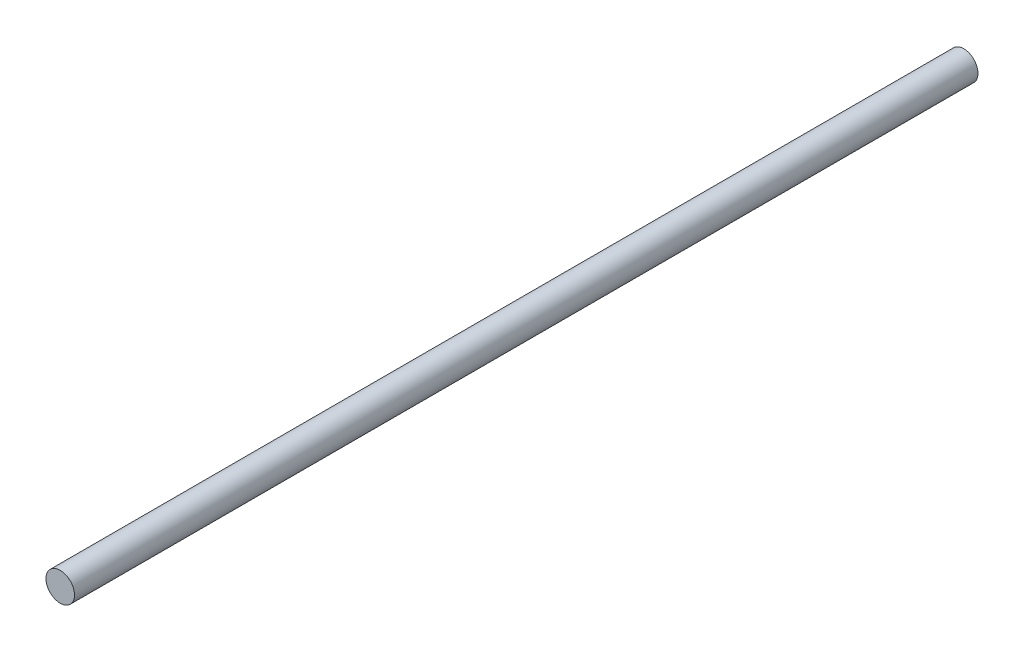
ISO-10303-21;
HEADER;
FILE_DESCRIPTION(('STEP AP214'),'2;1');
FILE_NAME('part.step','',(''),(''),'','','');
FILE_SCHEMA(('AUTOMOTIVE_DESIGN { 1 0 10303 214 1 1 1 1 }'));
ENDSEC;
DATA;
#1=APPLICATION_CONTEXT('core data for automotive mechanical design processes');
#2=APPLICATION_PROTOCOL_DEFINITION('international standard','automotive_design',2000,#1);
#3=PRODUCT_CONTEXT('',#1,'mechanical');
#4=PRODUCT('Part','Part','',(#3));
#5=PRODUCT_RELATED_PRODUCT_CATEGORY('part','',(#4));
#6=PRODUCT_DEFINITION_FORMATION('','',#4);
#7=PRODUCT_DEFINITION_CONTEXT('part definition',#1,'design');
#8=PRODUCT_DEFINITION('design','',#6,#7);
#9=PRODUCT_DEFINITION_SHAPE('','',#8);
#10=(LENGTH_UNIT() NAMED_UNIT(*) SI_UNIT(.MILLI.,.METRE.));
#11=(NAMED_UNIT(*) PLANE_ANGLE_UNIT() SI_UNIT($,.RADIAN.));
#12=(NAMED_UNIT(*) SI_UNIT($,.STERADIAN.) SOLID_ANGLE_UNIT());
#13=UNCERTAINTY_MEASURE_WITH_UNIT(LENGTH_MEASURE(1.E-05),#10,'distance_accuracy_value','');
#14=(GEOMETRIC_REPRESENTATION_CONTEXT(3) GLOBAL_UNCERTAINTY_ASSIGNED_CONTEXT((#13)) GLOBAL_UNIT_ASSIGNED_CONTEXT((#10,
#11,#12)) REPRESENTATION_CONTEXT('',''));
#15=CARTESIAN_POINT('',(0.,0.,0.));
#16=DIRECTION('',(0.,0.,1.));
#17=DIRECTION('',(1.,0.,0.));
#18=AXIS2_PLACEMENT_3D('',#15,#16,#17);
#19=CARTESIAN_POINT('',(0.,0.,190.));
#20=DIRECTION('',(0.,0.,-1.));
#21=DIRECTION('',(-1.,0.,0.));
#22=AXIS2_PLACEMENT_3D('',#19,#20,#21);
#23=CYLINDRICAL_SURFACE('',#22,3.);
#24=CARTESIAN_POINT('',(0.,0.,190.));
#25=DIRECTION('',(0.,0.,1.));
#26=DIRECTION('',(1.,0.,0.));
#27=AXIS2_PLACEMENT_3D('',#24,#25,#26);
#28=CIRCLE('',#27,3.);
#29=CARTESIAN_POINT('',(3.,0.,190.));
#30=VERTEX_POINT('',#29);
#31=EDGE_CURVE('E10',#30,#30,#28,.T.);
#32=ORIENTED_EDGE('',*,*,#31,.F.);
#33=EDGE_LOOP('',(#32));
#34=FACE_BOUND('',#33,.T.);
#35=CARTESIAN_POINT('',(0.,0.,0.));
#36=DIRECTION('',(0.,0.,1.));
#37=DIRECTION('',(1.,0.,0.));
#38=AXIS2_PLACEMENT_3D('',#35,#36,#37);
#39=CIRCLE('',#38,3.);
#40=CARTESIAN_POINT('',(3.,0.,0.));
#41=VERTEX_POINT('',#40);
#42=EDGE_CURVE('E41',#41,#41,#39,.T.);
#43=ORIENTED_EDGE('',*,*,#42,.T.);
#44=EDGE_LOOP('',(#43));
#45=FACE_BOUND('',#44,.T.);
#46=ADVANCED_FACE('F38',(#34,#45),#23,.T.);
#47=CARTESIAN_POINT('',(0.,0.,190.));
#48=DIRECTION('',(0.,0.,1.));
#49=DIRECTION('',(1.,0.,0.));
#50=AXIS2_PLACEMENT_3D('',#47,#48,#49);
#51=PLANE('',#50);
#52=ORIENTED_EDGE('',*,*,#31,.T.);
#53=EDGE_LOOP('',(#52));
#54=FACE_BOUND('',#53,.T.);
#55=ADVANCED_FACE('F53',(#54),#51,.T.);
#56=CARTESIAN_POINT('',(0.,0.,0.));
#57=DIRECTION('',(0.,0.,1.));
#58=DIRECTION('',(1.,0.,0.));
#59=AXIS2_PLACEMENT_3D('',#56,#57,#58);
#60=PLANE('',#59);
#61=ORIENTED_EDGE('',*,*,#42,.F.);
#62=EDGE_LOOP('',(#61));
#63=FACE_BOUND('',#62,.T.);
#64=ADVANCED_FACE('F51',(#63),#60,.F.);
#65=CLOSED_SHELL('',(#46,#55,#64));
#66=MANIFOLD_SOLID_BREP('B2',#65);
#67=ADVANCED_BREP_SHAPE_REPRESENTATION('',(#18,#66),#14);
#68=SHAPE_DEFINITION_REPRESENTATION(#9,#67);
ENDSEC;
END-ISO-10303-21;
